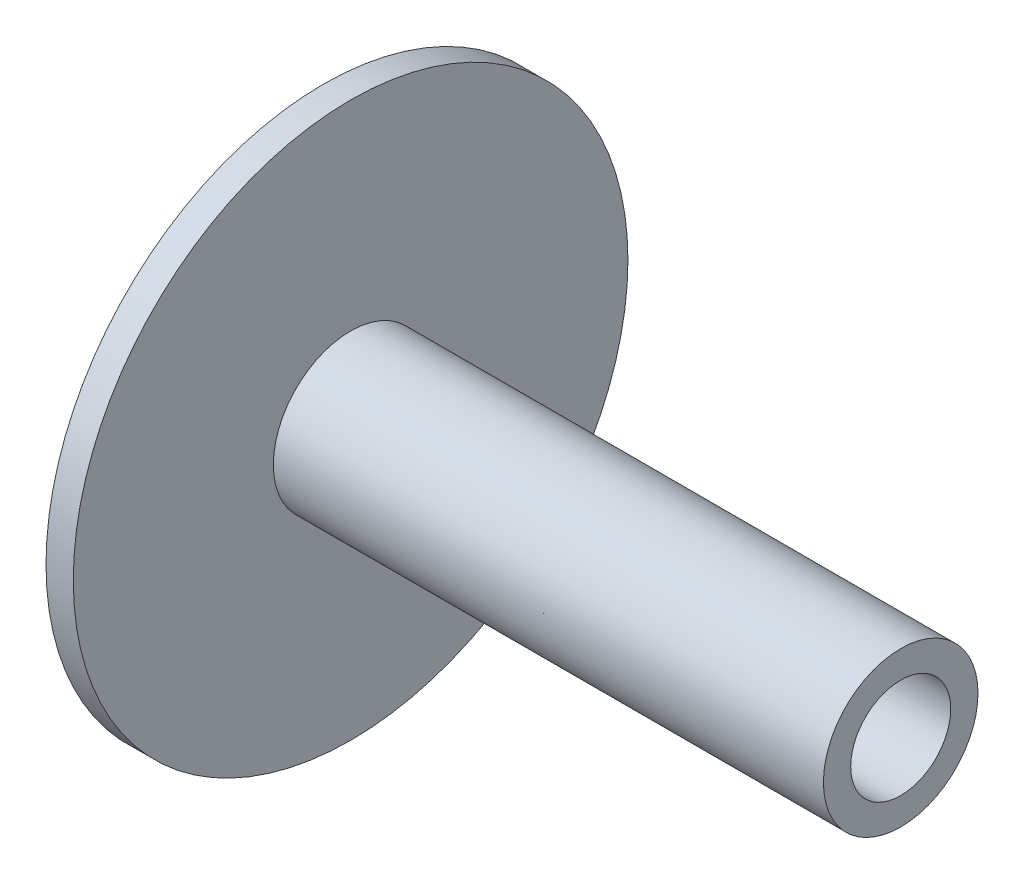
ISO-10303-21;
HEADER;
FILE_DESCRIPTION(('STEP AP214'),'2;1');
FILE_NAME('part.step','',(''),(''),'','','');
FILE_SCHEMA(('AUTOMOTIVE_DESIGN { 1 0 10303 214 1 1 1 1 }'));
ENDSEC;
DATA;
#1=APPLICATION_CONTEXT('core data for automotive mechanical design processes');
#2=APPLICATION_PROTOCOL_DEFINITION('international standard','automotive_design',2000,#1);
#3=PRODUCT_CONTEXT('',#1,'mechanical');
#4=PRODUCT('Part','Part','',(#3));
#5=PRODUCT_RELATED_PRODUCT_CATEGORY('part','',(#4));
#6=PRODUCT_DEFINITION_FORMATION('','',#4);
#7=PRODUCT_DEFINITION_CONTEXT('part definition',#1,'design');
#8=PRODUCT_DEFINITION('design','',#6,#7);
#9=PRODUCT_DEFINITION_SHAPE('','',#8);
#10=(LENGTH_UNIT() NAMED_UNIT(*) SI_UNIT(.MILLI.,.METRE.));
#11=(NAMED_UNIT(*) PLANE_ANGLE_UNIT() SI_UNIT($,.RADIAN.));
#12=(NAMED_UNIT(*) SI_UNIT($,.STERADIAN.) SOLID_ANGLE_UNIT());
#13=UNCERTAINTY_MEASURE_WITH_UNIT(LENGTH_MEASURE(1.E-05),#10,'distance_accuracy_value','');
#14=(GEOMETRIC_REPRESENTATION_CONTEXT(3) GLOBAL_UNCERTAINTY_ASSIGNED_CONTEXT((#13)) GLOBAL_UNIT_ASSIGNED_CONTEXT((#10,
#11,#12)) REPRESENTATION_CONTEXT('',''));
#15=CARTESIAN_POINT('',(0.,0.,0.));
#16=DIRECTION('',(0.,0.,1.));
#17=DIRECTION('',(1.,0.,0.));
#18=AXIS2_PLACEMENT_3D('',#15,#16,#17);
#19=CARTESIAN_POINT('',(24.2,0.,0.));
#20=DIRECTION('',(1.,0.,0.));
#21=DIRECTION('',(0.,0.,-1.));
#22=AXIS2_PLACEMENT_3D('',#19,#20,#21);
#23=PLANE('',#22);
#24=CARTESIAN_POINT('',(24.2,0.,0.));
#25=DIRECTION('',(1.,0.,0.));
#26=DIRECTION('',(0.,0.,-1.));
#27=AXIS2_PLACEMENT_3D('',#24,#25,#26);
#28=CIRCLE('',#27,3.4);
#29=CARTESIAN_POINT('',(24.2,0.,-3.4));
#30=VERTEX_POINT('',#29);
#31=EDGE_CURVE('E10',#30,#30,#28,.T.);
#32=ORIENTED_EDGE('',*,*,#31,.T.);
#33=EDGE_LOOP('',(#32));
#34=FACE_BOUND('',#33,.T.);
#35=CARTESIAN_POINT('',(24.2,0.,0.));
#36=DIRECTION('',(1.,0.,0.));
#37=DIRECTION('',(0.,0.,-1.));
#38=AXIS2_PLACEMENT_3D('',#35,#36,#37);
#39=CIRCLE('',#38,2.2);
#40=CARTESIAN_POINT('',(24.2,0.,-2.2));
#41=VERTEX_POINT('',#40);
#42=EDGE_CURVE('E37',#41,#41,#39,.T.);
#43=ORIENTED_EDGE('',*,*,#42,.F.);
#44=EDGE_LOOP('',(#43));
#45=FACE_BOUND('',#44,.T.);
#46=ADVANCED_FACE('F30',(#34,#45),#23,.T.);
#47=CARTESIAN_POINT('',(24.2,0.,0.));
#48=DIRECTION('',(-1.,0.,0.));
#49=DIRECTION('',(0.,0.,1.));
#50=AXIS2_PLACEMENT_3D('',#47,#48,#49);
#51=CYLINDRICAL_SURFACE('',#50,3.4);
#52=ORIENTED_EDGE('',*,*,#31,.F.);
#53=EDGE_LOOP('',(#52));
#54=FACE_BOUND('',#53,.T.);
#55=CARTESIAN_POINT('',(0.,0.,0.));
#56=DIRECTION('',(-1.,0.,0.));
#57=DIRECTION('',(0.,0.,1.));
#58=AXIS2_PLACEMENT_3D('',#55,#56,#57);
#59=CIRCLE('',#58,3.4);
#60=CARTESIAN_POINT('',(0.,0.,3.4));
#61=VERTEX_POINT('',#60);
#62=EDGE_CURVE('E41',#61,#61,#59,.T.);
#63=ORIENTED_EDGE('',*,*,#62,.F.);
#64=EDGE_LOOP('',(#63));
#65=FACE_BOUND('',#64,.T.);
#66=ADVANCED_FACE('F32',(#54,#65),#51,.T.);
#67=CARTESIAN_POINT('',(24.2,0.,0.));
#68=DIRECTION('',(-1.,0.,0.));
#69=DIRECTION('',(0.,0.,1.));
#70=AXIS2_PLACEMENT_3D('',#67,#68,#69);
#71=CYLINDRICAL_SURFACE('',#70,2.2);
#72=ORIENTED_EDGE('',*,*,#42,.T.);
#73=EDGE_LOOP('',(#72));
#74=FACE_BOUND('',#73,.T.);
#75=CARTESIAN_POINT('',(-1.2,0.,0.));
#76=DIRECTION('',(-1.,0.,0.));
#77=DIRECTION('',(0.,0.,1.));
#78=AXIS2_PLACEMENT_3D('',#75,#76,#77);
#79=CIRCLE('',#78,2.2);
#80=CARTESIAN_POINT('',(-1.2,0.,2.2));
#81=VERTEX_POINT('',#80);
#82=EDGE_CURVE('E51',#81,#81,#79,.T.);
#83=ORIENTED_EDGE('',*,*,#82,.T.);
#84=EDGE_LOOP('',(#83));
#85=FACE_BOUND('',#84,.T.);
#86=ADVANCED_FACE('F57',(#74,#85),#71,.F.);
#87=CARTESIAN_POINT('',(0.,0.,0.));
#88=DIRECTION('',(-1.,0.,0.));
#89=DIRECTION('',(0.,0.,1.));
#90=AXIS2_PLACEMENT_3D('',#87,#88,#89);
#91=PLANE('',#90);
#92=CARTESIAN_POINT('',(0.,0.,0.));
#93=DIRECTION('',(-1.,0.,0.));
#94=DIRECTION('',(0.,0.,1.));
#95=AXIS2_PLACEMENT_3D('',#92,#93,#94);
#96=CIRCLE('',#95,12.2);
#97=CARTESIAN_POINT('',(0.,0.,12.2));
#98=VERTEX_POINT('',#97);
#99=EDGE_CURVE('E48',#98,#98,#96,.T.);
#100=ORIENTED_EDGE('',*,*,#99,.F.);
#101=EDGE_LOOP('',(#100));
#102=FACE_BOUND('',#101,.T.);
#103=ORIENTED_EDGE('',*,*,#62,.T.);
#104=EDGE_LOOP('',(#103));
#105=FACE_BOUND('',#104,.T.);
#106=ADVANCED_FACE('F62',(#102,#105),#91,.F.);
#107=CARTESIAN_POINT('',(-1.2,0.,0.));
#108=DIRECTION('',(-1.,0.,0.));
#109=DIRECTION('',(0.,0.,1.));
#110=AXIS2_PLACEMENT_3D('',#107,#108,#109);
#111=PLANE('',#110);
#112=CARTESIAN_POINT('',(-1.2,0.,0.));
#113=DIRECTION('',(-1.,0.,0.));
#114=DIRECTION('',(0.,0.,1.));
#115=AXIS2_PLACEMENT_3D('',#112,#113,#114);
#116=CIRCLE('',#115,12.2);
#117=CARTESIAN_POINT('',(-1.2,0.,12.2));
#118=VERTEX_POINT('',#117);
#119=EDGE_CURVE('E45',#118,#118,#116,.T.);
#120=ORIENTED_EDGE('',*,*,#119,.T.);
#121=EDGE_LOOP('',(#120));
#122=FACE_BOUND('',#121,.T.);
#123=ORIENTED_EDGE('',*,*,#82,.F.);
#124=EDGE_LOOP('',(#123));
#125=FACE_BOUND('',#124,.T.);
#126=ADVANCED_FACE('F59',(#122,#125),#111,.T.);
#127=CARTESIAN_POINT('',(-1.2,0.,0.));
#128=DIRECTION('',(1.,0.,0.));
#129=DIRECTION('',(0.,0.,-1.));
#130=AXIS2_PLACEMENT_3D('',#127,#128,#129);
#131=CYLINDRICAL_SURFACE('',#130,12.2);
#132=ORIENTED_EDGE('',*,*,#119,.F.);
#133=EDGE_LOOP('',(#132));
#134=FACE_BOUND('',#133,.T.);
#135=ORIENTED_EDGE('',*,*,#99,.T.);
#136=EDGE_LOOP('',(#135));
#137=FACE_BOUND('',#136,.T.);
#138=ADVANCED_FACE('F61',(#134,#137),#131,.T.);
#139=CLOSED_SHELL('',(#46,#66,#86,#106,#126,#138));
#140=MANIFOLD_SOLID_BREP('B2',#139);
#141=ADVANCED_BREP_SHAPE_REPRESENTATION('',(#18,#140),#14);
#142=SHAPE_DEFINITION_REPRESENTATION(#9,#141);
ENDSEC;
END-ISO-10303-21;
